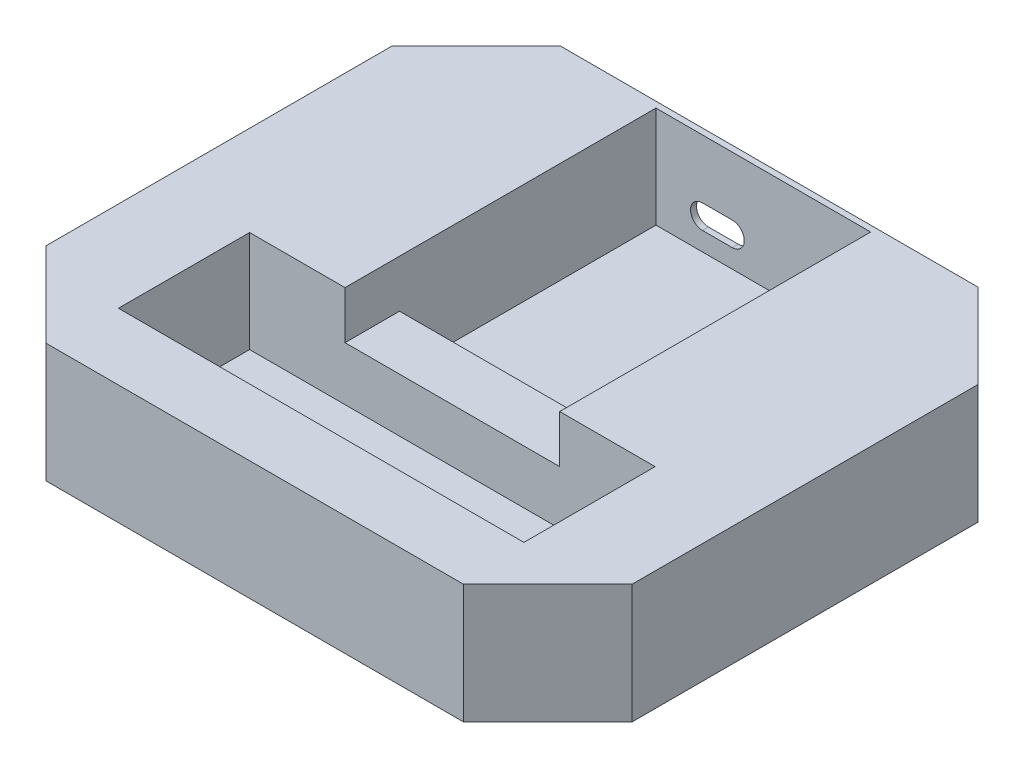
ISO-10303-21;
HEADER;
FILE_DESCRIPTION(('STEP AP214'),'2;1');
FILE_NAME('part.step','',(''),(''),'','','');
FILE_SCHEMA(('AUTOMOTIVE_DESIGN { 1 0 10303 214 1 1 1 1 }'));
ENDSEC;
DATA;
#1=APPLICATION_CONTEXT('core data for automotive mechanical design processes');
#2=APPLICATION_PROTOCOL_DEFINITION('international standard','automotive_design',2000,#1);
#3=PRODUCT_CONTEXT('',#1,'mechanical');
#4=PRODUCT('Part','Part','',(#3));
#5=PRODUCT_RELATED_PRODUCT_CATEGORY('part','',(#4));
#6=PRODUCT_DEFINITION_FORMATION('','',#4);
#7=PRODUCT_DEFINITION_CONTEXT('part definition',#1,'design');
#8=PRODUCT_DEFINITION('design','',#6,#7);
#9=PRODUCT_DEFINITION_SHAPE('','',#8);
#10=(LENGTH_UNIT() NAMED_UNIT(*) SI_UNIT(.MILLI.,.METRE.));
#11=(NAMED_UNIT(*) PLANE_ANGLE_UNIT() SI_UNIT($,.RADIAN.));
#12=(NAMED_UNIT(*) SI_UNIT($,.STERADIAN.) SOLID_ANGLE_UNIT());
#13=UNCERTAINTY_MEASURE_WITH_UNIT(LENGTH_MEASURE(1.E-05),#10,'distance_accuracy_value','');
#14=(GEOMETRIC_REPRESENTATION_CONTEXT(3) GLOBAL_UNCERTAINTY_ASSIGNED_CONTEXT((#13)) GLOBAL_UNIT_ASSIGNED_CONTEXT((#10,
#11,#12)) REPRESENTATION_CONTEXT('',''));
#15=CARTESIAN_POINT('',(0.,0.,0.));
#16=DIRECTION('',(0.,0.,1.));
#17=DIRECTION('',(1.,0.,0.));
#18=AXIS2_PLACEMENT_3D('',#15,#16,#17);
#19=CARTESIAN_POINT('',(-49.1421356237309,20.,-29.));
#20=DIRECTION('',(0.70710678118655,0.,0.707106781186545));
#21=DIRECTION('',(0.707106781186545,0.,-0.70710678118655));
#22=AXIS2_PLACEMENT_3D('',#19,#20,#21);
#23=PLANE('',#22);
#24=DIRECTION('',(-0.707106781186545,0.,0.70710678118655));
#25=VECTOR('',#24,1.);
#26=CARTESIAN_POINT('',(-49.1421356237309,0.,-29.));
#27=LINE('',#26,#25);
#28=CARTESIAN_POINT('',(-35.,0.,-43.142135623731));
#29=VERTEX_POINT('',#28);
#30=CARTESIAN_POINT('',(-49.1421356237309,0.,-29.));
#31=VERTEX_POINT('',#30);
#32=EDGE_CURVE('E295',#29,#31,#27,.T.);
#33=ORIENTED_EDGE('',*,*,#32,.T.);
#34=DIRECTION('',(0.,-1.,0.));
#35=VECTOR('',#34,1.);
#36=CARTESIAN_POINT('',(-49.1421356237309,20.,-29.));
#37=LINE('',#36,#35);
#38=CARTESIAN_POINT('',(-49.1421356237309,20.,-29.));
#39=VERTEX_POINT('',#38);
#40=EDGE_CURVE('E11',#39,#31,#37,.T.);
#41=ORIENTED_EDGE('',*,*,#40,.F.);
#42=DIRECTION('',(-0.707106781186545,0.,0.70710678118655));
#43=VECTOR('',#42,1.);
#44=CARTESIAN_POINT('',(-49.1421356237309,20.,-29.));
#45=LINE('',#44,#43);
#46=CARTESIAN_POINT('',(-35.,20.,-43.142135623731));
#47=VERTEX_POINT('',#46);
#48=EDGE_CURVE('E350',#47,#39,#45,.T.);
#49=ORIENTED_EDGE('',*,*,#48,.F.);
#50=DIRECTION('',(0.,-1.,0.));
#51=VECTOR('',#50,1.);
#52=CARTESIAN_POINT('',(-35.,20.,-43.142135623731));
#53=LINE('',#52,#51);
#54=EDGE_CURVE('E376',#47,#29,#53,.T.);
#55=ORIENTED_EDGE('',*,*,#54,.T.);
#56=EDGE_LOOP('',(#33,#41,#49,#55));
#57=FACE_BOUND('',#56,.T.);
#58=ADVANCED_FACE('F44',(#57),#23,.F.);
#59=CARTESIAN_POINT('',(-49.1421356237309,20.,29.));
#60=DIRECTION('',(1.,0.,0.));
#61=DIRECTION('',(0.,0.,-1.));
#62=AXIS2_PLACEMENT_3D('',#59,#60,#61);
#63=PLANE('',#62);
#64=DIRECTION('',(0.,0.,1.));
#65=VECTOR('',#64,1.);
#66=CARTESIAN_POINT('',(-49.1421356237309,0.,29.));
#67=LINE('',#66,#65);
#68=CARTESIAN_POINT('',(-49.1421356237309,0.,29.));
#69=VERTEX_POINT('',#68);
#70=EDGE_CURVE('E380',#31,#69,#67,.T.);
#71=ORIENTED_EDGE('',*,*,#70,.T.);
#72=DIRECTION('',(0.,-1.,0.));
#73=VECTOR('',#72,1.);
#74=CARTESIAN_POINT('',(-49.1421356237309,20.,29.));
#75=LINE('',#74,#73);
#76=CARTESIAN_POINT('',(-49.1421356237309,20.,29.));
#77=VERTEX_POINT('',#76);
#78=EDGE_CURVE('E52',#77,#69,#75,.T.);
#79=ORIENTED_EDGE('',*,*,#78,.F.);
#80=DIRECTION('',(0.,0.,1.));
#81=VECTOR('',#80,1.);
#82=CARTESIAN_POINT('',(-49.1421356237309,20.,29.));
#83=LINE('',#82,#81);
#84=EDGE_CURVE('E354',#39,#77,#83,.T.);
#85=ORIENTED_EDGE('',*,*,#84,.F.);
#86=ORIENTED_EDGE('',*,*,#40,.T.);
#87=EDGE_LOOP('',(#71,#79,#85,#86));
#88=FACE_BOUND('',#87,.T.);
#89=ADVANCED_FACE('F451',(#88),#63,.F.);
#90=CARTESIAN_POINT('',(-35.,20.,43.1421356237309));
#91=DIRECTION('',(0.707106781186549,0.,-0.707106781186546));
#92=DIRECTION('',(-0.707106781186546,0.,-0.707106781186549));
#93=AXIS2_PLACEMENT_3D('',#90,#91,#92);
#94=PLANE('',#93);
#95=DIRECTION('',(0.707106781186546,0.,0.707106781186549));
#96=VECTOR('',#95,1.);
#97=CARTESIAN_POINT('',(-35.,0.,43.1421356237309));
#98=LINE('',#97,#96);
#99=CARTESIAN_POINT('',(-35.,0.,43.1421356237309));
#100=VERTEX_POINT('',#99);
#101=EDGE_CURVE('E383',#69,#100,#98,.T.);
#102=ORIENTED_EDGE('',*,*,#101,.T.);
#103=DIRECTION('',(0.,-1.,0.));
#104=VECTOR('',#103,1.);
#105=CARTESIAN_POINT('',(-35.,20.,43.1421356237309));
#106=LINE('',#105,#104);
#107=CARTESIAN_POINT('',(-35.,20.,43.1421356237309));
#108=VERTEX_POINT('',#107);
#109=EDGE_CURVE('E419',#108,#100,#106,.T.);
#110=ORIENTED_EDGE('',*,*,#109,.F.);
#111=DIRECTION('',(0.707106781186546,0.,0.707106781186549));
#112=VECTOR('',#111,1.);
#113=CARTESIAN_POINT('',(-35.,20.,43.1421356237309));
#114=LINE('',#113,#112);
#115=EDGE_CURVE('E358',#77,#108,#114,.T.);
#116=ORIENTED_EDGE('',*,*,#115,.F.);
#117=ORIENTED_EDGE('',*,*,#78,.T.);
#118=EDGE_LOOP('',(#102,#110,#116,#117));
#119=FACE_BOUND('',#118,.T.);
#120=ADVANCED_FACE('F428',(#119),#94,.F.);
#121=CARTESIAN_POINT('',(35.,20.,43.1421356237309));
#122=DIRECTION('',(0.,0.,-1.));
#123=DIRECTION('',(-1.,0.,0.));
#124=AXIS2_PLACEMENT_3D('',#121,#122,#123);
#125=PLANE('',#124);
#126=DIRECTION('',(1.,0.,0.));
#127=VECTOR('',#126,1.);
#128=CARTESIAN_POINT('',(35.,0.,43.1421356237309));
#129=LINE('',#128,#127);
#130=CARTESIAN_POINT('',(35.,0.,43.1421356237309));
#131=VERTEX_POINT('',#130);
#132=EDGE_CURVE('E386',#100,#131,#129,.T.);
#133=ORIENTED_EDGE('',*,*,#132,.T.);
#134=DIRECTION('',(0.,-1.,0.));
#135=VECTOR('',#134,1.);
#136=CARTESIAN_POINT('',(35.,20.,43.1421356237309));
#137=LINE('',#136,#135);
#138=CARTESIAN_POINT('',(35.,20.,43.1421356237309));
#139=VERTEX_POINT('',#138);
#140=EDGE_CURVE('E415',#139,#131,#137,.T.);
#141=ORIENTED_EDGE('',*,*,#140,.F.);
#142=DIRECTION('',(1.,0.,0.));
#143=VECTOR('',#142,1.);
#144=CARTESIAN_POINT('',(35.,20.,43.1421356237309));
#145=LINE('',#144,#143);
#146=EDGE_CURVE('E361',#108,#139,#145,.T.);
#147=ORIENTED_EDGE('',*,*,#146,.F.);
#148=ORIENTED_EDGE('',*,*,#109,.T.);
#149=EDGE_LOOP('',(#133,#141,#147,#148));
#150=FACE_BOUND('',#149,.T.);
#151=ADVANCED_FACE('F439',(#150),#125,.F.);
#152=CARTESIAN_POINT('',(49.1421356237309,20.,29.));
#153=DIRECTION('',(-0.707106781186548,0.,-0.707106781186547));
#154=DIRECTION('',(-0.707106781186547,0.,0.707106781186548));
#155=AXIS2_PLACEMENT_3D('',#152,#153,#154);
#156=PLANE('',#155);
#157=DIRECTION('',(0.707106781186547,0.,-0.707106781186548));
#158=VECTOR('',#157,1.);
#159=CARTESIAN_POINT('',(49.1421356237309,0.,29.));
#160=LINE('',#159,#158);
#161=CARTESIAN_POINT('',(49.1421356237309,0.,29.));
#162=VERTEX_POINT('',#161);
#163=EDGE_CURVE('E389',#131,#162,#160,.T.);
#164=ORIENTED_EDGE('',*,*,#163,.T.);
#165=DIRECTION('',(0.,-1.,0.));
#166=VECTOR('',#165,1.);
#167=CARTESIAN_POINT('',(49.1421356237309,20.,29.));
#168=LINE('',#167,#166);
#169=CARTESIAN_POINT('',(49.1421356237309,20.,29.));
#170=VERTEX_POINT('',#169);
#171=EDGE_CURVE('E411',#170,#162,#168,.T.);
#172=ORIENTED_EDGE('',*,*,#171,.F.);
#173=DIRECTION('',(0.707106781186547,0.,-0.707106781186548));
#174=VECTOR('',#173,1.);
#175=CARTESIAN_POINT('',(49.1421356237309,20.,29.));
#176=LINE('',#175,#174);
#177=EDGE_CURVE('E364',#139,#170,#176,.T.);
#178=ORIENTED_EDGE('',*,*,#177,.F.);
#179=ORIENTED_EDGE('',*,*,#140,.T.);
#180=EDGE_LOOP('',(#164,#172,#178,#179));
#181=FACE_BOUND('',#180,.T.);
#182=ADVANCED_FACE('F443',(#181),#156,.F.);
#183=CARTESIAN_POINT('',(49.1421356237309,20.,-29.));
#184=DIRECTION('',(-1.,0.,0.));
#185=DIRECTION('',(0.,0.,1.));
#186=AXIS2_PLACEMENT_3D('',#183,#184,#185);
#187=PLANE('',#186);
#188=DIRECTION('',(0.,0.,-1.));
#189=VECTOR('',#188,1.);
#190=CARTESIAN_POINT('',(49.1421356237309,0.,-29.));
#191=LINE('',#190,#189);
#192=CARTESIAN_POINT('',(49.1421356237309,0.,-29.));
#193=VERTEX_POINT('',#192);
#194=EDGE_CURVE('E392',#162,#193,#191,.T.);
#195=ORIENTED_EDGE('',*,*,#194,.T.);
#196=DIRECTION('',(0.,-1.,0.));
#197=VECTOR('',#196,1.);
#198=CARTESIAN_POINT('',(49.1421356237309,20.,-29.));
#199=LINE('',#198,#197);
#200=CARTESIAN_POINT('',(49.1421356237309,20.,-29.));
#201=VERTEX_POINT('',#200);
#202=EDGE_CURVE('E407',#201,#193,#199,.T.);
#203=ORIENTED_EDGE('',*,*,#202,.F.);
#204=DIRECTION('',(0.,0.,-1.));
#205=VECTOR('',#204,1.);
#206=CARTESIAN_POINT('',(49.1421356237309,20.,-29.));
#207=LINE('',#206,#205);
#208=EDGE_CURVE('E367',#170,#201,#207,.T.);
#209=ORIENTED_EDGE('',*,*,#208,.F.);
#210=ORIENTED_EDGE('',*,*,#171,.T.);
#211=EDGE_LOOP('',(#195,#203,#209,#210));
#212=FACE_BOUND('',#211,.T.);
#213=ADVANCED_FACE('F462',(#212),#187,.F.);
#214=CARTESIAN_POINT('',(35.,20.,-43.142135623731));
#215=DIRECTION('',(-0.707106781186549,0.,0.707106781186546));
#216=DIRECTION('',(0.707106781186546,0.,0.707106781186549));
#217=AXIS2_PLACEMENT_3D('',#214,#215,#216);
#218=PLANE('',#217);
#219=DIRECTION('',(-0.707106781186546,0.,-0.707106781186549));
#220=VECTOR('',#219,1.);
#221=CARTESIAN_POINT('',(35.,0.,-43.142135623731));
#222=LINE('',#221,#220);
#223=CARTESIAN_POINT('',(35.,0.,-43.142135623731));
#224=VERTEX_POINT('',#223);
#225=EDGE_CURVE('E395',#193,#224,#222,.T.);
#226=ORIENTED_EDGE('',*,*,#225,.T.);
#227=DIRECTION('',(0.,-1.,0.));
#228=VECTOR('',#227,1.);
#229=CARTESIAN_POINT('',(35.,20.,-43.142135623731));
#230=LINE('',#229,#228);
#231=CARTESIAN_POINT('',(35.,20.,-43.142135623731));
#232=VERTEX_POINT('',#231);
#233=EDGE_CURVE('E403',#232,#224,#230,.T.);
#234=ORIENTED_EDGE('',*,*,#233,.F.);
#235=DIRECTION('',(-0.707106781186546,0.,-0.707106781186549));
#236=VECTOR('',#235,1.);
#237=CARTESIAN_POINT('',(35.,20.,-43.142135623731));
#238=LINE('',#237,#236);
#239=EDGE_CURVE('E370',#201,#232,#238,.T.);
#240=ORIENTED_EDGE('',*,*,#239,.F.);
#241=ORIENTED_EDGE('',*,*,#202,.T.);
#242=EDGE_LOOP('',(#226,#234,#240,#241));
#243=FACE_BOUND('',#242,.T.);
#244=ADVANCED_FACE('F460',(#243),#218,.F.);
#245=CARTESIAN_POINT('',(-35.,20.,-43.142135623731));
#246=DIRECTION('',(0.,0.,1.));
#247=DIRECTION('',(1.,0.,0.));
#248=AXIS2_PLACEMENT_3D('',#245,#246,#247);
#249=PLANE('',#248);
#250=DIRECTION('',(1.,0.,0.));
#251=VECTOR('',#250,1.);
#252=CARTESIAN_POINT('',(-10.2,10.13,-43.142135623731));
#253=LINE('',#252,#251);
#254=CARTESIAN_POINT('',(-10.2,10.13,-43.142135623731));
#255=VERTEX_POINT('',#254);
#256=CARTESIAN_POINT('',(-5.2,10.13,-43.142135623731));
#257=VERTEX_POINT('',#256);
#258=EDGE_CURVE('E215',#255,#257,#253,.T.);
#259=ORIENTED_EDGE('',*,*,#258,.F.);
#260=CARTESIAN_POINT('',(-10.2,8.13,-43.142135623731));
#261=DIRECTION('',(0.,0.,1.));
#262=DIRECTION('',(1.,0.,0.));
#263=AXIS2_PLACEMENT_3D('',#260,#261,#262);
#264=CIRCLE('',#263,2.);
#265=CARTESIAN_POINT('',(-10.2,6.13,-43.142135623731));
#266=VERTEX_POINT('',#265);
#267=EDGE_CURVE('E195',#266,#255,#264,.F.);
#268=ORIENTED_EDGE('',*,*,#267,.F.);
#269=DIRECTION('',(-1.,0.,0.));
#270=VECTOR('',#269,1.);
#271=CARTESIAN_POINT('',(-10.2,6.13,-43.142135623731));
#272=LINE('',#271,#270);
#273=CARTESIAN_POINT('',(-5.2,6.13,-43.142135623731));
#274=VERTEX_POINT('',#273);
#275=EDGE_CURVE('E205',#274,#266,#272,.T.);
#276=ORIENTED_EDGE('',*,*,#275,.F.);
#277=CARTESIAN_POINT('',(-5.2,8.13,-43.142135623731));
#278=DIRECTION('',(0.,0.,1.));
#279=DIRECTION('',(1.,0.,0.));
#280=AXIS2_PLACEMENT_3D('',#277,#278,#279);
#281=CIRCLE('',#280,2.);
#282=EDGE_CURVE('E59',#257,#274,#281,.F.);
#283=ORIENTED_EDGE('',*,*,#282,.F.);
#284=EDGE_LOOP('',(#259,#268,#276,#283));
#285=FACE_BOUND('',#284,.T.);
#286=DIRECTION('',(-1.,0.,0.));
#287=VECTOR('',#286,1.);
#288=CARTESIAN_POINT('',(-35.,0.,-43.142135623731));
#289=LINE('',#288,#287);
#290=EDGE_CURVE('E355',#224,#29,#289,.T.);
#291=ORIENTED_EDGE('',*,*,#290,.T.);
#292=ORIENTED_EDGE('',*,*,#54,.F.);
#293=DIRECTION('',(-1.,0.,0.));
#294=VECTOR('',#293,1.);
#295=CARTESIAN_POINT('',(-35.,20.,-43.142135623731));
#296=LINE('',#295,#294);
#297=EDGE_CURVE('E373',#232,#47,#296,.T.);
#298=ORIENTED_EDGE('',*,*,#297,.F.);
#299=ORIENTED_EDGE('',*,*,#233,.T.);
#300=EDGE_LOOP('',(#291,#292,#298,#299));
#301=FACE_BOUND('',#300,.T.);
#302=ADVANCED_FACE('F212',(#285,#301),#249,.F.);
#303=CARTESIAN_POINT('',(0.,20.,0.));
#304=DIRECTION('',(0.,-1.,0.));
#305=DIRECTION('',(0.,0.,-1.));
#306=AXIS2_PLACEMENT_3D('',#303,#304,#305);
#307=PLANE('',#306);
#308=DIRECTION('',(0.,0.,-1.));
#309=VECTOR('',#308,1.);
#310=CARTESIAN_POINT('',(18.,20.,-42.142135623731));
#311=LINE('',#310,#309);
#312=CARTESIAN_POINT('',(18.,20.,10.));
#313=VERTEX_POINT('',#312);
#314=CARTESIAN_POINT('',(18.,20.,-42.142135623731));
#315=VERTEX_POINT('',#314);
#316=EDGE_CURVE('E281',#313,#315,#311,.T.);
#317=ORIENTED_EDGE('',*,*,#316,.F.);
#318=DIRECTION('',(-1.,0.,0.));
#319=VECTOR('',#318,1.);
#320=CARTESIAN_POINT('',(-34.,20.,10.));
#321=LINE('',#320,#319);
#322=CARTESIAN_POINT('',(34.,20.,10.));
#323=VERTEX_POINT('',#322);
#324=EDGE_CURVE('E330',#323,#313,#321,.T.);
#325=ORIENTED_EDGE('',*,*,#324,.F.);
#326=DIRECTION('',(0.,0.,-1.));
#327=VECTOR('',#326,1.);
#328=CARTESIAN_POINT('',(34.,20.,10.));
#329=LINE('',#328,#327);
#330=CARTESIAN_POINT('',(34.,20.,32.));
#331=VERTEX_POINT('',#330);
#332=EDGE_CURVE('E285',#331,#323,#329,.T.);
#333=ORIENTED_EDGE('',*,*,#332,.F.);
#334=DIRECTION('',(1.,0.,0.));
#335=VECTOR('',#334,1.);
#336=CARTESIAN_POINT('',(-34.,20.,32.));
#337=LINE('',#336,#335);
#338=CARTESIAN_POINT('',(-34.,20.,32.));
#339=VERTEX_POINT('',#338);
#340=EDGE_CURVE('E320',#339,#331,#337,.T.);
#341=ORIENTED_EDGE('',*,*,#340,.F.);
#342=DIRECTION('',(0.,0.,1.));
#343=VECTOR('',#342,1.);
#344=CARTESIAN_POINT('',(-34.,20.,10.));
#345=LINE('',#344,#343);
#346=CARTESIAN_POINT('',(-34.,20.,10.));
#347=VERTEX_POINT('',#346);
#348=EDGE_CURVE('E324',#347,#339,#345,.T.);
#349=ORIENTED_EDGE('',*,*,#348,.F.);
#350=CARTESIAN_POINT('',(-18.,20.,10.));
#351=VERTEX_POINT('',#350);
#352=EDGE_CURVE('E329',#351,#347,#321,.T.);
#353=ORIENTED_EDGE('',*,*,#352,.F.);
#354=DIRECTION('',(0.,0.,1.));
#355=VECTOR('',#354,1.);
#356=CARTESIAN_POINT('',(-18.,20.,-42.142135623731));
#357=LINE('',#356,#355);
#358=CARTESIAN_POINT('',(-18.,20.,-42.142135623731));
#359=VERTEX_POINT('',#358);
#360=EDGE_CURVE('E268',#359,#351,#357,.T.);
#361=ORIENTED_EDGE('',*,*,#360,.F.);
#362=DIRECTION('',(-1.,0.,0.));
#363=VECTOR('',#362,1.);
#364=CARTESIAN_POINT('',(-18.,20.,-42.142135623731));
#365=LINE('',#364,#363);
#366=EDGE_CURVE('E284',#315,#359,#365,.T.);
#367=ORIENTED_EDGE('',*,*,#366,.F.);
#368=EDGE_LOOP('',(#317,#325,#333,#341,#349,#353,#361,#367));
#369=FACE_BOUND('',#368,.T.);
#370=ORIENTED_EDGE('',*,*,#48,.T.);
#371=ORIENTED_EDGE('',*,*,#84,.T.);
#372=ORIENTED_EDGE('',*,*,#115,.T.);
#373=ORIENTED_EDGE('',*,*,#146,.T.);
#374=ORIENTED_EDGE('',*,*,#177,.T.);
#375=ORIENTED_EDGE('',*,*,#208,.T.);
#376=ORIENTED_EDGE('',*,*,#239,.T.);
#377=ORIENTED_EDGE('',*,*,#297,.T.);
#378=EDGE_LOOP('',(#370,#371,#372,#373,#374,#375,#376,#377));
#379=FACE_BOUND('',#378,.T.);
#380=ADVANCED_FACE('F447',(#369,#379),#307,.F.);
#381=CARTESIAN_POINT('',(0.,0.,0.));
#382=DIRECTION('',(0.,-1.,0.));
#383=DIRECTION('',(0.,0.,-1.));
#384=AXIS2_PLACEMENT_3D('',#381,#382,#383);
#385=PLANE('',#384);
#386=ORIENTED_EDGE('',*,*,#32,.F.);
#387=ORIENTED_EDGE('',*,*,#290,.F.);
#388=ORIENTED_EDGE('',*,*,#225,.F.);
#389=ORIENTED_EDGE('',*,*,#194,.F.);
#390=ORIENTED_EDGE('',*,*,#163,.F.);
#391=ORIENTED_EDGE('',*,*,#132,.F.);
#392=ORIENTED_EDGE('',*,*,#101,.F.);
#393=ORIENTED_EDGE('',*,*,#70,.F.);
#394=EDGE_LOOP('',(#386,#387,#388,#389,#390,#391,#392,#393));
#395=FACE_BOUND('',#394,.T.);
#396=ADVANCED_FACE('F434',(#395),#385,.T.);
#397=CARTESIAN_POINT('',(34.,3.,10.));
#398=DIRECTION('',(1.,0.,0.));
#399=DIRECTION('',(0.,0.,-1.));
#400=AXIS2_PLACEMENT_3D('',#397,#398,#399);
#401=PLANE('',#400);
#402=ORIENTED_EDGE('',*,*,#332,.T.);
#403=DIRECTION('',(0.,1.,0.));
#404=VECTOR('',#403,1.);
#405=CARTESIAN_POINT('',(34.,3.,10.));
#406=LINE('',#405,#404);
#407=CARTESIAN_POINT('',(34.,3.,10.));
#408=VERTEX_POINT('',#407);
#409=EDGE_CURVE('E306',#408,#323,#406,.T.);
#410=ORIENTED_EDGE('',*,*,#409,.F.);
#411=DIRECTION('',(0.,0.,-1.));
#412=VECTOR('',#411,1.);
#413=CARTESIAN_POINT('',(34.,3.,10.));
#414=LINE('',#413,#412);
#415=CARTESIAN_POINT('',(34.,3.,32.));
#416=VERTEX_POINT('',#415);
#417=EDGE_CURVE('E325',#416,#408,#414,.T.);
#418=ORIENTED_EDGE('',*,*,#417,.F.);
#419=DIRECTION('',(0.,1.,0.));
#420=VECTOR('',#419,1.);
#421=CARTESIAN_POINT('',(34.,3.,32.));
#422=LINE('',#421,#420);
#423=EDGE_CURVE('E259',#416,#331,#422,.T.);
#424=ORIENTED_EDGE('',*,*,#423,.T.);
#425=EDGE_LOOP('',(#402,#410,#418,#424));
#426=FACE_BOUND('',#425,.T.);
#427=ADVANCED_FACE('F529',(#426),#401,.F.);
#428=CARTESIAN_POINT('',(-34.,3.,32.));
#429=DIRECTION('',(0.,0.,1.));
#430=DIRECTION('',(1.,0.,0.));
#431=AXIS2_PLACEMENT_3D('',#428,#429,#430);
#432=PLANE('',#431);
#433=ORIENTED_EDGE('',*,*,#340,.T.);
#434=ORIENTED_EDGE('',*,*,#423,.F.);
#435=DIRECTION('',(1.,0.,0.));
#436=VECTOR('',#435,1.);
#437=CARTESIAN_POINT('',(-34.,3.,32.));
#438=LINE('',#437,#436);
#439=CARTESIAN_POINT('',(-34.,3.,32.));
#440=VERTEX_POINT('',#439);
#441=EDGE_CURVE('E310',#440,#416,#438,.T.);
#442=ORIENTED_EDGE('',*,*,#441,.F.);
#443=DIRECTION('',(0.,1.,0.));
#444=VECTOR('',#443,1.);
#445=CARTESIAN_POINT('',(-34.,3.,32.));
#446=LINE('',#445,#444);
#447=EDGE_CURVE('E315',#440,#339,#446,.T.);
#448=ORIENTED_EDGE('',*,*,#447,.T.);
#449=EDGE_LOOP('',(#433,#434,#442,#448));
#450=FACE_BOUND('',#449,.T.);
#451=ADVANCED_FACE('F538',(#450),#432,.F.);
#452=CARTESIAN_POINT('',(-34.,3.,10.));
#453=DIRECTION('',(-1.,0.,0.));
#454=DIRECTION('',(0.,0.,1.));
#455=AXIS2_PLACEMENT_3D('',#452,#453,#454);
#456=PLANE('',#455);
#457=ORIENTED_EDGE('',*,*,#348,.T.);
#458=ORIENTED_EDGE('',*,*,#447,.F.);
#459=DIRECTION('',(0.,0.,1.));
#460=VECTOR('',#459,1.);
#461=CARTESIAN_POINT('',(-34.,3.,10.));
#462=LINE('',#461,#460);
#463=CARTESIAN_POINT('',(-34.,3.,10.));
#464=VERTEX_POINT('',#463);
#465=EDGE_CURVE('E339',#464,#440,#462,.T.);
#466=ORIENTED_EDGE('',*,*,#465,.F.);
#467=DIRECTION('',(0.,1.,0.));
#468=VECTOR('',#467,1.);
#469=CARTESIAN_POINT('',(-34.,3.,10.));
#470=LINE('',#469,#468);
#471=EDGE_CURVE('E311',#464,#347,#470,.T.);
#472=ORIENTED_EDGE('',*,*,#471,.T.);
#473=EDGE_LOOP('',(#457,#458,#466,#472));
#474=FACE_BOUND('',#473,.T.);
#475=ADVANCED_FACE('F548',(#474),#456,.F.);
#476=CARTESIAN_POINT('',(-34.,3.,10.));
#477=DIRECTION('',(0.,0.,-1.));
#478=DIRECTION('',(-1.,0.,0.));
#479=AXIS2_PLACEMENT_3D('',#476,#477,#478);
#480=PLANE('',#479);
#481=ORIENTED_EDGE('',*,*,#324,.T.);
#482=DIRECTION('',(0.,1.,0.));
#483=VECTOR('',#482,1.);
#484=CARTESIAN_POINT('',(18.,12.,10.));
#485=LINE('',#484,#483);
#486=CARTESIAN_POINT('',(18.,12.,10.));
#487=VERTEX_POINT('',#486);
#488=EDGE_CURVE('E255',#487,#313,#485,.T.);
#489=ORIENTED_EDGE('',*,*,#488,.F.);
#490=DIRECTION('',(1.,0.,0.));
#491=VECTOR('',#490,1.);
#492=CARTESIAN_POINT('',(-18.,12.,10.));
#493=LINE('',#492,#491);
#494=CARTESIAN_POINT('',(-18.,12.,10.));
#495=VERTEX_POINT('',#494);
#496=EDGE_CURVE('E250',#495,#487,#493,.T.);
#497=ORIENTED_EDGE('',*,*,#496,.F.);
#498=DIRECTION('',(0.,1.,0.));
#499=VECTOR('',#498,1.);
#500=CARTESIAN_POINT('',(-18.,12.,10.));
#501=LINE('',#500,#499);
#502=EDGE_CURVE('E254',#495,#351,#501,.T.);
#503=ORIENTED_EDGE('',*,*,#502,.T.);
#504=ORIENTED_EDGE('',*,*,#352,.T.);
#505=ORIENTED_EDGE('',*,*,#471,.F.);
#506=DIRECTION('',(-1.,0.,0.));
#507=VECTOR('',#506,1.);
#508=CARTESIAN_POINT('',(-34.,3.,10.));
#509=LINE('',#508,#507);
#510=EDGE_CURVE('E343',#408,#464,#509,.T.);
#511=ORIENTED_EDGE('',*,*,#510,.F.);
#512=ORIENTED_EDGE('',*,*,#409,.T.);
#513=EDGE_LOOP('',(#481,#489,#497,#503,#504,#505,#511,#512));
#514=FACE_BOUND('',#513,.T.);
#515=ADVANCED_FACE('F558',(#514),#480,.F.);
#516=CARTESIAN_POINT('',(0.,3.,0.));
#517=DIRECTION('',(0.,1.,0.));
#518=DIRECTION('',(0.,0.,1.));
#519=AXIS2_PLACEMENT_3D('',#516,#517,#518);
#520=PLANE('',#519);
#521=ORIENTED_EDGE('',*,*,#417,.T.);
#522=ORIENTED_EDGE('',*,*,#510,.T.);
#523=ORIENTED_EDGE('',*,*,#465,.T.);
#524=ORIENTED_EDGE('',*,*,#441,.T.);
#525=EDGE_LOOP('',(#521,#522,#523,#524));
#526=FACE_BOUND('',#525,.T.);
#527=ADVANCED_FACE('F568',(#526),#520,.T.);
#528=CARTESIAN_POINT('',(18.,3.,-42.142135623731));
#529=DIRECTION('',(1.,0.,0.));
#530=DIRECTION('',(0.,0.,-1.));
#531=AXIS2_PLACEMENT_3D('',#528,#529,#530);
#532=PLANE('',#531);
#533=ORIENTED_EDGE('',*,*,#316,.T.);
#534=DIRECTION('',(0.,1.,0.));
#535=VECTOR('',#534,1.);
#536=CARTESIAN_POINT('',(18.,3.,-42.142135623731));
#537=LINE('',#536,#535);
#538=CARTESIAN_POINT('',(18.,3.,-42.142135623731));
#539=VERTEX_POINT('',#538);
#540=EDGE_CURVE('E280',#539,#315,#537,.T.);
#541=ORIENTED_EDGE('',*,*,#540,.F.);
#542=DIRECTION('',(0.,0.,-1.));
#543=VECTOR('',#542,1.);
#544=CARTESIAN_POINT('',(18.,3.,-42.142135623731));
#545=LINE('',#544,#543);
#546=CARTESIAN_POINT('',(18.,3.,0.857864376269037));
#547=VERTEX_POINT('',#546);
#548=EDGE_CURVE('E263',#547,#539,#545,.T.);
#549=ORIENTED_EDGE('',*,*,#548,.F.);
#550=DIRECTION('',(0.,1.,0.));
#551=VECTOR('',#550,1.);
#552=CARTESIAN_POINT('',(18.,3.,0.857864376269037));
#553=LINE('',#552,#551);
#554=CARTESIAN_POINT('',(18.,12.,0.857864376269037));
#555=VERTEX_POINT('',#554);
#556=EDGE_CURVE('E291',#547,#555,#553,.T.);
#557=ORIENTED_EDGE('',*,*,#556,.T.);
#558=DIRECTION('',(0.,0.,-1.));
#559=VECTOR('',#558,1.);
#560=CARTESIAN_POINT('',(18.,12.,10.));
#561=LINE('',#560,#559);
#562=EDGE_CURVE('E209',#487,#555,#561,.T.);
#563=ORIENTED_EDGE('',*,*,#562,.F.);
#564=ORIENTED_EDGE('',*,*,#488,.T.);
#565=EDGE_LOOP('',(#533,#541,#549,#557,#563,#564));
#566=FACE_BOUND('',#565,.T.);
#567=ADVANCED_FACE('F578',(#566),#532,.F.);
#568=CARTESIAN_POINT('',(-18.,3.,0.857864376269037));
#569=DIRECTION('',(0.,0.,1.));
#570=DIRECTION('',(1.,0.,0.));
#571=AXIS2_PLACEMENT_3D('',#568,#569,#570);
#572=PLANE('',#571);
#573=DIRECTION('',(0.,1.,0.));
#574=VECTOR('',#573,1.);
#575=CARTESIAN_POINT('',(-18.,3.,0.857864376269037));
#576=LINE('',#575,#574);
#577=CARTESIAN_POINT('',(-18.,3.,0.857864376269037));
#578=VERTEX_POINT('',#577);
#579=CARTESIAN_POINT('',(-18.,12.,0.857864376269037));
#580=VERTEX_POINT('',#579);
#581=EDGE_CURVE('E296',#578,#580,#576,.T.);
#582=ORIENTED_EDGE('',*,*,#581,.T.);
#583=DIRECTION('',(-1.,0.,0.));
#584=VECTOR('',#583,1.);
#585=CARTESIAN_POINT('',(-18.,12.,0.857864376269037));
#586=LINE('',#585,#584);
#587=EDGE_CURVE('E243',#555,#580,#586,.T.);
#588=ORIENTED_EDGE('',*,*,#587,.F.);
#589=ORIENTED_EDGE('',*,*,#556,.F.);
#590=DIRECTION('',(1.,0.,0.));
#591=VECTOR('',#590,1.);
#592=CARTESIAN_POINT('',(-18.,3.,0.857864376269037));
#593=LINE('',#592,#591);
#594=EDGE_CURVE('E276',#578,#547,#593,.T.);
#595=ORIENTED_EDGE('',*,*,#594,.F.);
#596=EDGE_LOOP('',(#582,#588,#589,#595));
#597=FACE_BOUND('',#596,.T.);
#598=ADVANCED_FACE('F587',(#597),#572,.F.);
#599=CARTESIAN_POINT('',(-18.,3.,-42.142135623731));
#600=DIRECTION('',(-1.,0.,0.));
#601=DIRECTION('',(0.,0.,1.));
#602=AXIS2_PLACEMENT_3D('',#599,#600,#601);
#603=PLANE('',#602);
#604=ORIENTED_EDGE('',*,*,#360,.T.);
#605=ORIENTED_EDGE('',*,*,#502,.F.);
#606=DIRECTION('',(0.,0.,1.));
#607=VECTOR('',#606,1.);
#608=CARTESIAN_POINT('',(-18.,12.,10.));
#609=LINE('',#608,#607);
#610=EDGE_CURVE('E246',#580,#495,#609,.T.);
#611=ORIENTED_EDGE('',*,*,#610,.F.);
#612=ORIENTED_EDGE('',*,*,#581,.F.);
#613=DIRECTION('',(0.,0.,1.));
#614=VECTOR('',#613,1.);
#615=CARTESIAN_POINT('',(-18.,3.,-42.142135623731));
#616=LINE('',#615,#614);
#617=CARTESIAN_POINT('',(-18.,3.,-42.142135623731));
#618=VERTEX_POINT('',#617);
#619=EDGE_CURVE('E272',#618,#578,#616,.T.);
#620=ORIENTED_EDGE('',*,*,#619,.F.);
#621=DIRECTION('',(0.,1.,0.));
#622=VECTOR('',#621,1.);
#623=CARTESIAN_POINT('',(-18.,3.,-42.142135623731));
#624=LINE('',#623,#622);
#625=EDGE_CURVE('E300',#618,#359,#624,.T.);
#626=ORIENTED_EDGE('',*,*,#625,.T.);
#627=EDGE_LOOP('',(#604,#605,#611,#612,#620,#626));
#628=FACE_BOUND('',#627,.T.);
#629=ADVANCED_FACE('F597',(#628),#603,.F.);
#630=CARTESIAN_POINT('',(-18.,3.,-42.142135623731));
#631=DIRECTION('',(0.,0.,-1.));
#632=DIRECTION('',(-1.,0.,0.));
#633=AXIS2_PLACEMENT_3D('',#630,#631,#632);
#634=PLANE('',#633);
#635=DIRECTION('',(1.,0.,0.));
#636=VECTOR('',#635,1.);
#637=CARTESIAN_POINT('',(-10.2,6.13,-42.142135623731));
#638=LINE('',#637,#636);
#639=CARTESIAN_POINT('',(-10.2,6.13,-42.142135623731));
#640=VERTEX_POINT('',#639);
#641=CARTESIAN_POINT('',(-5.2,6.13,-42.142135623731));
#642=VERTEX_POINT('',#641);
#643=EDGE_CURVE('E220',#640,#642,#638,.T.);
#644=ORIENTED_EDGE('',*,*,#643,.F.);
#645=CARTESIAN_POINT('',(-10.2,8.13,-42.142135623731));
#646=DIRECTION('',(0.,0.,1.));
#647=DIRECTION('',(1.,0.,0.));
#648=AXIS2_PLACEMENT_3D('',#645,#646,#647);
#649=CIRCLE('',#648,2.);
#650=CARTESIAN_POINT('',(-10.2,10.13,-42.142135623731));
#651=VERTEX_POINT('',#650);
#652=EDGE_CURVE('E67',#651,#640,#649,.T.);
#653=ORIENTED_EDGE('',*,*,#652,.F.);
#654=DIRECTION('',(-1.,0.,0.));
#655=VECTOR('',#654,1.);
#656=CARTESIAN_POINT('',(-10.2,10.13,-42.142135623731));
#657=LINE('',#656,#655);
#658=CARTESIAN_POINT('',(-5.2,10.13,-42.142135623731));
#659=VERTEX_POINT('',#658);
#660=EDGE_CURVE('E202',#659,#651,#657,.T.);
#661=ORIENTED_EDGE('',*,*,#660,.F.);
#662=CARTESIAN_POINT('',(-5.2,8.13,-42.142135623731));
#663=DIRECTION('',(0.,0.,1.));
#664=DIRECTION('',(1.,0.,0.));
#665=AXIS2_PLACEMENT_3D('',#662,#663,#664);
#666=CIRCLE('',#665,2.);
#667=EDGE_CURVE('E227',#642,#659,#666,.T.);
#668=ORIENTED_EDGE('',*,*,#667,.F.);
#669=EDGE_LOOP('',(#644,#653,#661,#668));
#670=FACE_BOUND('',#669,.T.);
#671=ORIENTED_EDGE('',*,*,#366,.T.);
#672=ORIENTED_EDGE('',*,*,#625,.F.);
#673=DIRECTION('',(-1.,0.,0.));
#674=VECTOR('',#673,1.);
#675=CARTESIAN_POINT('',(-18.,3.,-42.142135623731));
#676=LINE('',#675,#674);
#677=EDGE_CURVE('E267',#539,#618,#676,.T.);
#678=ORIENTED_EDGE('',*,*,#677,.F.);
#679=ORIENTED_EDGE('',*,*,#540,.T.);
#680=EDGE_LOOP('',(#671,#672,#678,#679));
#681=FACE_BOUND('',#680,.T.);
#682=ADVANCED_FACE('F607',(#670,#681),#634,.F.);
#683=CARTESIAN_POINT('',(0.,3.,0.));
#684=DIRECTION('',(0.,1.,0.));
#685=DIRECTION('',(0.,0.,1.));
#686=AXIS2_PLACEMENT_3D('',#683,#684,#685);
#687=PLANE('',#686);
#688=ORIENTED_EDGE('',*,*,#548,.T.);
#689=ORIENTED_EDGE('',*,*,#677,.T.);
#690=ORIENTED_EDGE('',*,*,#619,.T.);
#691=ORIENTED_EDGE('',*,*,#594,.T.);
#692=EDGE_LOOP('',(#688,#689,#690,#691));
#693=FACE_BOUND('',#692,.T.);
#694=ADVANCED_FACE('F616',(#693),#687,.T.);
#695=CARTESIAN_POINT('',(0.,12.,0.));
#696=DIRECTION('',(0.,-1.,0.));
#697=DIRECTION('',(0.,0.,-1.));
#698=AXIS2_PLACEMENT_3D('',#695,#696,#697);
#699=PLANE('',#698);
#700=ORIENTED_EDGE('',*,*,#562,.T.);
#701=ORIENTED_EDGE('',*,*,#587,.T.);
#702=ORIENTED_EDGE('',*,*,#610,.T.);
#703=ORIENTED_EDGE('',*,*,#496,.T.);
#704=EDGE_LOOP('',(#700,#701,#702,#703));
#705=FACE_BOUND('',#704,.T.);
#706=ADVANCED_FACE('F626',(#705),#699,.F.);
#707=CARTESIAN_POINT('',(-10.2,8.13,-43.143135623731));
#708=DIRECTION('',(0.,0.,1.));
#709=DIRECTION('',(1.,0.,0.));
#710=AXIS2_PLACEMENT_3D('',#707,#708,#709);
#711=CYLINDRICAL_SURFACE('',#710,2.);
#712=ORIENTED_EDGE('',*,*,#267,.T.);
#713=DIRECTION('',(0.,0.,1.));
#714=VECTOR('',#713,1.);
#715=CARTESIAN_POINT('',(-10.2,10.13,-43.143135623731));
#716=LINE('',#715,#714);
#717=EDGE_CURVE('E210',#255,#651,#716,.T.);
#718=ORIENTED_EDGE('',*,*,#717,.T.);
#719=ORIENTED_EDGE('',*,*,#652,.T.);
#720=DIRECTION('',(0.,0.,1.));
#721=VECTOR('',#720,1.);
#722=CARTESIAN_POINT('',(-10.2,6.13,-43.143135623731));
#723=LINE('',#722,#721);
#724=EDGE_CURVE('E191',#266,#640,#723,.T.);
#725=ORIENTED_EDGE('',*,*,#724,.F.);
#726=EDGE_LOOP('',(#712,#718,#719,#725));
#727=FACE_BOUND('',#726,.T.);
#728=ADVANCED_FACE('F193',(#727),#711,.F.);
#729=CARTESIAN_POINT('',(-10.2,10.13,-43.143135623731));
#730=DIRECTION('',(0.,1.,0.));
#731=DIRECTION('',(0.,0.,1.));
#732=AXIS2_PLACEMENT_3D('',#729,#730,#731);
#733=PLANE('',#732);
#734=ORIENTED_EDGE('',*,*,#258,.T.);
#735=DIRECTION('',(0.,0.,1.));
#736=VECTOR('',#735,1.);
#737=CARTESIAN_POINT('',(-5.2,10.13,-43.143135623731));
#738=LINE('',#737,#736);
#739=EDGE_CURVE('E236',#257,#659,#738,.T.);
#740=ORIENTED_EDGE('',*,*,#739,.T.);
#741=ORIENTED_EDGE('',*,*,#660,.T.);
#742=ORIENTED_EDGE('',*,*,#717,.F.);
#743=EDGE_LOOP('',(#734,#740,#741,#742));
#744=FACE_BOUND('',#743,.T.);
#745=ADVANCED_FACE('F643',(#744),#733,.F.);
#746=CARTESIAN_POINT('',(-5.2,8.13,-43.143135623731));
#747=DIRECTION('',(0.,0.,1.));
#748=DIRECTION('',(1.,0.,0.));
#749=AXIS2_PLACEMENT_3D('',#746,#747,#748);
#750=CYLINDRICAL_SURFACE('',#749,2.);
#751=ORIENTED_EDGE('',*,*,#282,.T.);
#752=DIRECTION('',(0.,0.,1.));
#753=VECTOR('',#752,1.);
#754=CARTESIAN_POINT('',(-5.2,6.13,-43.143135623731));
#755=LINE('',#754,#753);
#756=EDGE_CURVE('E201',#274,#642,#755,.T.);
#757=ORIENTED_EDGE('',*,*,#756,.T.);
#758=ORIENTED_EDGE('',*,*,#667,.T.);
#759=ORIENTED_EDGE('',*,*,#739,.F.);
#760=EDGE_LOOP('',(#751,#757,#758,#759));
#761=FACE_BOUND('',#760,.T.);
#762=ADVANCED_FACE('F652',(#761),#750,.F.);
#763=CARTESIAN_POINT('',(-10.2,6.13,-43.143135623731));
#764=DIRECTION('',(0.,-1.,0.));
#765=DIRECTION('',(0.,0.,-1.));
#766=AXIS2_PLACEMENT_3D('',#763,#764,#765);
#767=PLANE('',#766);
#768=ORIENTED_EDGE('',*,*,#275,.T.);
#769=ORIENTED_EDGE('',*,*,#724,.T.);
#770=ORIENTED_EDGE('',*,*,#643,.T.);
#771=ORIENTED_EDGE('',*,*,#756,.F.);
#772=EDGE_LOOP('',(#768,#769,#770,#771));
#773=FACE_BOUND('',#772,.T.);
#774=ADVANCED_FACE('F206',(#773),#767,.F.);
#775=CLOSED_SHELL('',(#58,#89,#120,#151,#182,#213,#244,#302,#380,#396,#427,#451,#475,#515,#527,
#567,#598,#629,#682,#694,#706,#728,#745,#762,#774));
#776=MANIFOLD_SOLID_BREP('B2',#775);
#777=ADVANCED_BREP_SHAPE_REPRESENTATION('',(#18,#776),#14);
#778=SHAPE_DEFINITION_REPRESENTATION(#9,#777);
ENDSEC;
END-ISO-10303-21;
